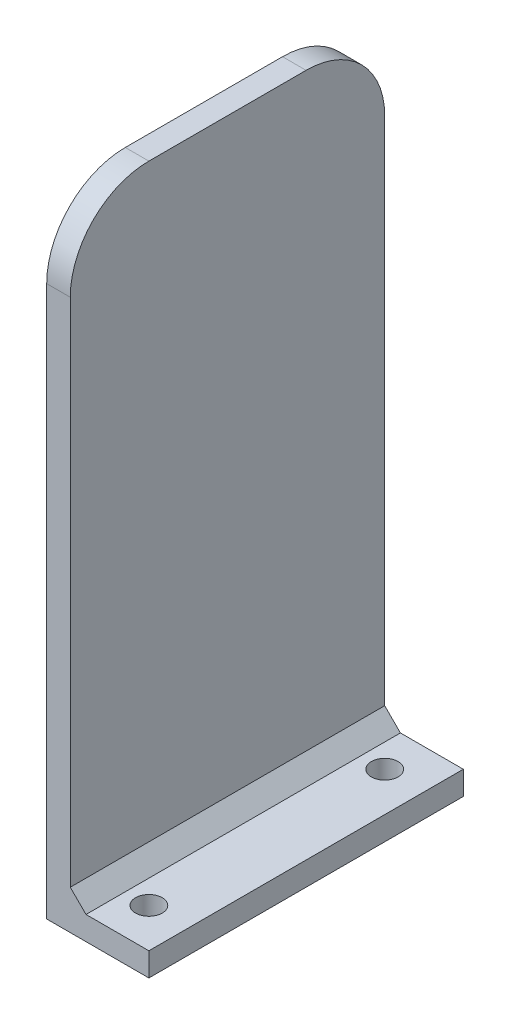
ISO-10303-21;
HEADER;
FILE_DESCRIPTION(('STEP AP214'),'2;1');
FILE_NAME('part.step','',(''),(''),'','','');
FILE_SCHEMA(('AUTOMOTIVE_DESIGN { 1 0 10303 214 1 1 1 1 }'));
ENDSEC;
DATA;
#1=APPLICATION_CONTEXT('core data for automotive mechanical design processes');
#2=APPLICATION_PROTOCOL_DEFINITION('international standard','automotive_design',2000,#1);
#3=PRODUCT_CONTEXT('',#1,'mechanical');
#4=PRODUCT('Part','Part','',(#3));
#5=PRODUCT_RELATED_PRODUCT_CATEGORY('part','',(#4));
#6=PRODUCT_DEFINITION_FORMATION('','',#4);
#7=PRODUCT_DEFINITION_CONTEXT('part definition',#1,'design');
#8=PRODUCT_DEFINITION('design','',#6,#7);
#9=PRODUCT_DEFINITION_SHAPE('','',#8);
#10=(LENGTH_UNIT() NAMED_UNIT(*) SI_UNIT(.MILLI.,.METRE.));
#11=(NAMED_UNIT(*) PLANE_ANGLE_UNIT() SI_UNIT($,.RADIAN.));
#12=(NAMED_UNIT(*) SI_UNIT($,.STERADIAN.) SOLID_ANGLE_UNIT());
#13=UNCERTAINTY_MEASURE_WITH_UNIT(LENGTH_MEASURE(1.E-05),#10,'distance_accuracy_value','');
#14=(GEOMETRIC_REPRESENTATION_CONTEXT(3) GLOBAL_UNCERTAINTY_ASSIGNED_CONTEXT((#13)) GLOBAL_UNIT_ASSIGNED_CONTEXT((#10,
#11,#12)) REPRESENTATION_CONTEXT('',''));
#15=CARTESIAN_POINT('',(0.,0.,0.));
#16=DIRECTION('',(0.,0.,1.));
#17=DIRECTION('',(1.,0.,0.));
#18=AXIS2_PLACEMENT_3D('',#15,#16,#17);
#19=CARTESIAN_POINT('',(0.,80.,20.));
#20=DIRECTION('',(1.,0.,0.));
#21=DIRECTION('',(0.,1.,0.));
#22=AXIS2_PLACEMENT_3D('',#19,#20,#21);
#23=PLANE('',#22);
#24=DIRECTION('',(0.,-1.,0.));
#25=VECTOR('',#24,1.);
#26=CARTESIAN_POINT('',(0.,80.,20.));
#27=LINE('',#26,#25);
#28=CARTESIAN_POINT('',(0.,70.,20.));
#29=VERTEX_POINT('',#28);
#30=CARTESIAN_POINT('',(0.,0.,20.));
#31=VERTEX_POINT('',#30);
#32=EDGE_CURVE('E113',#29,#31,#27,.T.);
#33=ORIENTED_EDGE('',*,*,#32,.F.);
#34=CARTESIAN_POINT('',(0.,70.,10.));
#35=DIRECTION('',(1.,0.,0.));
#36=DIRECTION('',(0.,1.,0.));
#37=AXIS2_PLACEMENT_3D('',#34,#35,#36);
#38=CIRCLE('',#37,10.);
#39=CARTESIAN_POINT('',(0.,80.,10.));
#40=VERTEX_POINT('',#39);
#41=EDGE_CURVE('E153',#29,#40,#38,.F.);
#42=ORIENTED_EDGE('',*,*,#41,.T.);
#43=DIRECTION('',(0.,0.,-1.));
#44=VECTOR('',#43,1.);
#45=CARTESIAN_POINT('',(0.,80.,20.));
#46=LINE('',#45,#44);
#47=CARTESIAN_POINT('',(0.,80.,-10.));
#48=VERTEX_POINT('',#47);
#49=EDGE_CURVE('E170',#40,#48,#46,.T.);
#50=ORIENTED_EDGE('',*,*,#49,.T.);
#51=CARTESIAN_POINT('',(0.,70.,-10.));
#52=DIRECTION('',(1.,0.,0.));
#53=DIRECTION('',(0.,1.,0.));
#54=AXIS2_PLACEMENT_3D('',#51,#52,#53);
#55=CIRCLE('',#54,10.);
#56=CARTESIAN_POINT('',(0.,70.,-20.));
#57=VERTEX_POINT('',#56);
#58=EDGE_CURVE('E151',#48,#57,#55,.F.);
#59=ORIENTED_EDGE('',*,*,#58,.T.);
#60=DIRECTION('',(0.,-1.,0.));
#61=VECTOR('',#60,1.);
#62=CARTESIAN_POINT('',(0.,80.,-20.));
#63=LINE('',#62,#61);
#64=CARTESIAN_POINT('',(0.,0.,-20.));
#65=VERTEX_POINT('',#64);
#66=EDGE_CURVE('E134',#57,#65,#63,.T.);
#67=ORIENTED_EDGE('',*,*,#66,.T.);
#68=DIRECTION('',(0.,0.,-1.));
#69=VECTOR('',#68,1.);
#70=CARTESIAN_POINT('',(0.,0.,20.));
#71=LINE('',#70,#69);
#72=EDGE_CURVE('E128',#31,#65,#71,.T.);
#73=ORIENTED_EDGE('',*,*,#72,.F.);
#74=EDGE_LOOP('',(#33,#42,#50,#59,#67,#73));
#75=FACE_BOUND('',#74,.T.);
#76=ADVANCED_FACE('F41',(#75),#23,.F.);
#77=CARTESIAN_POINT('',(0.,0.,20.));
#78=DIRECTION('',(0.,1.,0.));
#79=DIRECTION('',(0.,0.,1.));
#80=AXIS2_PLACEMENT_3D('',#77,#78,#79);
#81=PLANE('',#80);
#82=CARTESIAN_POINT('',(8.,0.,-15.));
#83=DIRECTION('',(0.,1.,0.));
#84=DIRECTION('',(0.,0.,1.));
#85=AXIS2_PLACEMENT_3D('',#82,#83,#84);
#86=CIRCLE('',#85,1.7);
#87=CARTESIAN_POINT('',(8.,0.,-13.3));
#88=VERTEX_POINT('',#87);
#89=EDGE_CURVE('E200',#88,#88,#86,.T.);
#90=ORIENTED_EDGE('',*,*,#89,.T.);
#91=EDGE_LOOP('',(#90));
#92=FACE_BOUND('',#91,.T.);
#93=CARTESIAN_POINT('',(8.,0.,15.));
#94=DIRECTION('',(0.,1.,0.));
#95=DIRECTION('',(0.,0.,1.));
#96=AXIS2_PLACEMENT_3D('',#93,#94,#95);
#97=CIRCLE('',#96,1.7);
#98=CARTESIAN_POINT('',(8.,0.,16.7));
#99=VERTEX_POINT('',#98);
#100=EDGE_CURVE('E206',#99,#99,#97,.T.);
#101=ORIENTED_EDGE('',*,*,#100,.T.);
#102=EDGE_LOOP('',(#101));
#103=FACE_BOUND('',#102,.T.);
#104=DIRECTION('',(1.,0.,0.));
#105=VECTOR('',#104,1.);
#106=CARTESIAN_POINT('',(0.,0.,-20.));
#107=LINE('',#106,#105);
#108=CARTESIAN_POINT('',(13.,0.,-20.));
#109=VERTEX_POINT('',#108);
#110=EDGE_CURVE('E196',#65,#109,#107,.T.);
#111=ORIENTED_EDGE('',*,*,#110,.T.);
#112=DIRECTION('',(0.,0.,-1.));
#113=VECTOR('',#112,1.);
#114=CARTESIAN_POINT('',(13.,0.,20.));
#115=LINE('',#114,#113);
#116=CARTESIAN_POINT('',(13.,0.,20.));
#117=VERTEX_POINT('',#116);
#118=EDGE_CURVE('E130',#117,#109,#115,.T.);
#119=ORIENTED_EDGE('',*,*,#118,.F.);
#120=DIRECTION('',(1.,0.,0.));
#121=VECTOR('',#120,1.);
#122=CARTESIAN_POINT('',(0.,0.,20.));
#123=LINE('',#122,#121);
#124=EDGE_CURVE('E117',#31,#117,#123,.T.);
#125=ORIENTED_EDGE('',*,*,#124,.F.);
#126=ORIENTED_EDGE('',*,*,#72,.T.);
#127=EDGE_LOOP('',(#111,#119,#125,#126));
#128=FACE_BOUND('',#127,.T.);
#129=ADVANCED_FACE('F127',(#92,#103,#128),#81,.F.);
#130=CARTESIAN_POINT('',(13.,0.,20.));
#131=DIRECTION('',(-1.,0.,0.));
#132=DIRECTION('',(0.,0.,1.));
#133=AXIS2_PLACEMENT_3D('',#130,#131,#132);
#134=PLANE('',#133);
#135=DIRECTION('',(0.,1.,0.));
#136=VECTOR('',#135,1.);
#137=CARTESIAN_POINT('',(13.,0.,-20.));
#138=LINE('',#137,#136);
#139=CARTESIAN_POINT('',(13.,3.,-20.));
#140=VERTEX_POINT('',#139);
#141=EDGE_CURVE('E195',#109,#140,#138,.T.);
#142=ORIENTED_EDGE('',*,*,#141,.T.);
#143=DIRECTION('',(0.,0.,-1.));
#144=VECTOR('',#143,1.);
#145=CARTESIAN_POINT('',(13.,3.,20.));
#146=LINE('',#145,#144);
#147=CARTESIAN_POINT('',(13.,3.,20.));
#148=VERTEX_POINT('',#147);
#149=EDGE_CURVE('E141',#148,#140,#146,.T.);
#150=ORIENTED_EDGE('',*,*,#149,.F.);
#151=DIRECTION('',(0.,1.,0.));
#152=VECTOR('',#151,1.);
#153=CARTESIAN_POINT('',(13.,0.,20.));
#154=LINE('',#153,#152);
#155=EDGE_CURVE('E132',#117,#148,#154,.T.);
#156=ORIENTED_EDGE('',*,*,#155,.F.);
#157=ORIENTED_EDGE('',*,*,#118,.T.);
#158=EDGE_LOOP('',(#142,#150,#156,#157));
#159=FACE_BOUND('',#158,.T.);
#160=ADVANCED_FACE('F221',(#159),#134,.F.);
#161=CARTESIAN_POINT('',(13.,3.,20.));
#162=DIRECTION('',(0.,-1.,0.));
#163=DIRECTION('',(1.,0.,0.));
#164=AXIS2_PLACEMENT_3D('',#161,#162,#163);
#165=PLANE('',#164);
#166=CARTESIAN_POINT('',(8.,3.,-15.));
#167=DIRECTION('',(0.,1.,0.));
#168=DIRECTION('',(-1.,0.,0.));
#169=AXIS2_PLACEMENT_3D('',#166,#167,#168);
#170=CIRCLE('',#169,1.7);
#171=CARTESIAN_POINT('',(6.3,3.,-15.));
#172=VERTEX_POINT('',#171);
#173=EDGE_CURVE('E209',#172,#172,#170,.T.);
#174=ORIENTED_EDGE('',*,*,#173,.F.);
#175=EDGE_LOOP('',(#174));
#176=FACE_BOUND('',#175,.T.);
#177=CARTESIAN_POINT('',(8.,3.,15.));
#178=DIRECTION('',(0.,1.,0.));
#179=DIRECTION('',(-1.,0.,0.));
#180=AXIS2_PLACEMENT_3D('',#177,#178,#179);
#181=CIRCLE('',#180,1.7);
#182=CARTESIAN_POINT('',(6.3,3.,15.));
#183=VERTEX_POINT('',#182);
#184=EDGE_CURVE('E210',#183,#183,#181,.T.);
#185=ORIENTED_EDGE('',*,*,#184,.F.);
#186=EDGE_LOOP('',(#185));
#187=FACE_BOUND('',#186,.T.);
#188=DIRECTION('',(-1.,0.,0.));
#189=VECTOR('',#188,1.);
#190=CARTESIAN_POINT('',(13.,3.,-20.));
#191=LINE('',#190,#189);
#192=CARTESIAN_POINT('',(5.,3.,-20.));
#193=VERTEX_POINT('',#192);
#194=EDGE_CURVE('E190',#140,#193,#191,.T.);
#195=ORIENTED_EDGE('',*,*,#194,.T.);
#196=DIRECTION('',(0.,0.,1.));
#197=VECTOR('',#196,1.);
#198=CARTESIAN_POINT('',(5.,3.,20.));
#199=LINE('',#198,#197);
#200=CARTESIAN_POINT('',(5.,3.,20.));
#201=VERTEX_POINT('',#200);
#202=EDGE_CURVE('E139',#193,#201,#199,.T.);
#203=ORIENTED_EDGE('',*,*,#202,.T.);
#204=DIRECTION('',(-1.,0.,0.));
#205=VECTOR('',#204,1.);
#206=CARTESIAN_POINT('',(13.,3.,20.));
#207=LINE('',#206,#205);
#208=EDGE_CURVE('E171',#148,#201,#207,.T.);
#209=ORIENTED_EDGE('',*,*,#208,.F.);
#210=ORIENTED_EDGE('',*,*,#149,.T.);
#211=EDGE_LOOP('',(#195,#203,#209,#210));
#212=FACE_BOUND('',#211,.T.);
#213=ADVANCED_FACE('F189',(#176,#187,#212),#165,.F.);
#214=CARTESIAN_POINT('',(3.,3.,20.));
#215=DIRECTION('',(-1.,0.,0.));
#216=DIRECTION('',(0.,-1.,0.));
#217=AXIS2_PLACEMENT_3D('',#214,#215,#216);
#218=PLANE('',#217);
#219=DIRECTION('',(0.,0.,-1.));
#220=VECTOR('',#219,1.);
#221=CARTESIAN_POINT('',(3.00000000000001,80.,20.));
#222=LINE('',#221,#220);
#223=CARTESIAN_POINT('',(3.00000000000001,80.,10.));
#224=VERTEX_POINT('',#223);
#225=CARTESIAN_POINT('',(3.00000000000001,80.,-10.));
#226=VERTEX_POINT('',#225);
#227=EDGE_CURVE('E165',#224,#226,#222,.T.);
#228=ORIENTED_EDGE('',*,*,#227,.F.);
#229=CARTESIAN_POINT('',(3.00000000000001,70.,10.));
#230=DIRECTION('',(-1.,0.,0.));
#231=DIRECTION('',(0.,-1.,0.));
#232=AXIS2_PLACEMENT_3D('',#229,#230,#231);
#233=CIRCLE('',#232,10.);
#234=CARTESIAN_POINT('',(3.00000000000001,70.,20.));
#235=VERTEX_POINT('',#234);
#236=EDGE_CURVE('E49',#224,#235,#233,.F.);
#237=ORIENTED_EDGE('',*,*,#236,.T.);
#238=DIRECTION('',(0.,1.,0.));
#239=VECTOR('',#238,1.);
#240=CARTESIAN_POINT('',(3.,3.,20.));
#241=LINE('',#240,#239);
#242=CARTESIAN_POINT('',(3.,5.00000000000002,20.));
#243=VERTEX_POINT('',#242);
#244=EDGE_CURVE('E163',#243,#235,#241,.T.);
#245=ORIENTED_EDGE('',*,*,#244,.F.);
#246=DIRECTION('',(0.,0.,-1.));
#247=VECTOR('',#246,1.);
#248=CARTESIAN_POINT('',(3.,5.00000000000002,-20.));
#249=LINE('',#248,#247);
#250=CARTESIAN_POINT('',(3.,5.00000000000002,-20.));
#251=VERTEX_POINT('',#250);
#252=EDGE_CURVE('E136',#243,#251,#249,.T.);
#253=ORIENTED_EDGE('',*,*,#252,.T.);
#254=DIRECTION('',(0.,1.,0.));
#255=VECTOR('',#254,1.);
#256=CARTESIAN_POINT('',(3.,3.,-20.));
#257=LINE('',#256,#255);
#258=CARTESIAN_POINT('',(3.00000000000001,70.,-20.));
#259=VERTEX_POINT('',#258);
#260=EDGE_CURVE('E123',#251,#259,#257,.T.);
#261=ORIENTED_EDGE('',*,*,#260,.T.);
#262=CARTESIAN_POINT('',(3.00000000000001,70.,-10.));
#263=DIRECTION('',(-1.,0.,0.));
#264=DIRECTION('',(0.,-1.,0.));
#265=AXIS2_PLACEMENT_3D('',#262,#263,#264);
#266=CIRCLE('',#265,10.);
#267=EDGE_CURVE('E61',#259,#226,#266,.F.);
#268=ORIENTED_EDGE('',*,*,#267,.T.);
#269=EDGE_LOOP('',(#228,#237,#245,#253,#261,#268));
#270=FACE_BOUND('',#269,.T.);
#271=ADVANCED_FACE('F162',(#270),#218,.F.);
#272=CARTESIAN_POINT('',(3.00000000000001,80.,20.));
#273=DIRECTION('',(0.,-1.,0.));
#274=DIRECTION('',(0.,0.,-1.));
#275=AXIS2_PLACEMENT_3D('',#272,#273,#274);
#276=PLANE('',#275);
#277=ORIENTED_EDGE('',*,*,#49,.F.);
#278=DIRECTION('',(-1.,0.,0.));
#279=VECTOR('',#278,1.);
#280=CARTESIAN_POINT('',(3.00000000000001,80.,10.));
#281=LINE('',#280,#279);
#282=EDGE_CURVE('E158',#40,#224,#281,.F.);
#283=ORIENTED_EDGE('',*,*,#282,.T.);
#284=ORIENTED_EDGE('',*,*,#227,.T.);
#285=DIRECTION('',(-1.,0.,0.));
#286=VECTOR('',#285,1.);
#287=CARTESIAN_POINT('',(3.00000000000001,80.,-10.));
#288=LINE('',#287,#286);
#289=EDGE_CURVE('E155',#226,#48,#288,.T.);
#290=ORIENTED_EDGE('',*,*,#289,.T.);
#291=EDGE_LOOP('',(#277,#283,#284,#290));
#292=FACE_BOUND('',#291,.T.);
#293=ADVANCED_FACE('F177',(#292),#276,.F.);
#294=CARTESIAN_POINT('',(0.,0.,20.));
#295=DIRECTION('',(0.,0.,1.));
#296=DIRECTION('',(1.,0.,0.));
#297=AXIS2_PLACEMENT_3D('',#294,#295,#296);
#298=PLANE('',#297);
#299=ORIENTED_EDGE('',*,*,#244,.T.);
#300=DIRECTION('',(-1.,0.,0.));
#301=VECTOR('',#300,1.);
#302=CARTESIAN_POINT('',(0.,70.,20.));
#303=LINE('',#302,#301);
#304=EDGE_CURVE('E120',#235,#29,#303,.T.);
#305=ORIENTED_EDGE('',*,*,#304,.T.);
#306=ORIENTED_EDGE('',*,*,#32,.T.);
#307=ORIENTED_EDGE('',*,*,#124,.T.);
#308=ORIENTED_EDGE('',*,*,#155,.T.);
#309=ORIENTED_EDGE('',*,*,#208,.T.);
#310=DIRECTION('',(0.707106781186545,-0.70710678118655,0.));
#311=VECTOR('',#310,1.);
#312=CARTESIAN_POINT('',(3.,5.00000000000002,20.));
#313=LINE('',#312,#311);
#314=EDGE_CURVE('E148',#201,#243,#313,.F.);
#315=ORIENTED_EDGE('',*,*,#314,.T.);
#316=EDGE_LOOP('',(#299,#305,#306,#307,#308,#309,#315));
#317=FACE_BOUND('',#316,.T.);
#318=ADVANCED_FACE('F116',(#317),#298,.T.);
#319=CARTESIAN_POINT('',(0.,0.,-20.));
#320=DIRECTION('',(0.,0.,1.));
#321=DIRECTION('',(1.,0.,0.));
#322=AXIS2_PLACEMENT_3D('',#319,#320,#321);
#323=PLANE('',#322);
#324=ORIENTED_EDGE('',*,*,#66,.F.);
#325=DIRECTION('',(-1.,0.,0.));
#326=VECTOR('',#325,1.);
#327=CARTESIAN_POINT('',(0.,70.,-20.));
#328=LINE('',#327,#326);
#329=EDGE_CURVE('E11',#57,#259,#328,.F.);
#330=ORIENTED_EDGE('',*,*,#329,.T.);
#331=ORIENTED_EDGE('',*,*,#260,.F.);
#332=DIRECTION('',(-0.707106781186545,0.70710678118655,0.));
#333=VECTOR('',#332,1.);
#334=CARTESIAN_POINT('',(4.00000000000002,3.99999999999999,-20.));
#335=LINE('',#334,#333);
#336=EDGE_CURVE('E146',#251,#193,#335,.F.);
#337=ORIENTED_EDGE('',*,*,#336,.T.);
#338=ORIENTED_EDGE('',*,*,#194,.F.);
#339=ORIENTED_EDGE('',*,*,#141,.F.);
#340=ORIENTED_EDGE('',*,*,#110,.F.);
#341=EDGE_LOOP('',(#324,#330,#331,#337,#338,#339,#340));
#342=FACE_BOUND('',#341,.T.);
#343=ADVANCED_FACE('F194',(#342),#323,.F.);
#344=CARTESIAN_POINT('',(8.00000000000001,-37.,15.));
#345=DIRECTION('',(0.,1.,0.));
#346=DIRECTION('',(-1.,0.,0.));
#347=AXIS2_PLACEMENT_3D('',#344,#345,#346);
#348=CYLINDRICAL_SURFACE('',#347,1.7);
#349=ORIENTED_EDGE('',*,*,#184,.T.);
#350=EDGE_LOOP('',(#349));
#351=FACE_BOUND('',#350,.T.);
#352=ORIENTED_EDGE('',*,*,#100,.F.);
#353=EDGE_LOOP('',(#352));
#354=FACE_BOUND('',#353,.T.);
#355=ADVANCED_FACE('F225',(#351,#354),#348,.F.);
#356=CARTESIAN_POINT('',(8.00000000000001,-37.,-15.));
#357=DIRECTION('',(0.,1.,0.));
#358=DIRECTION('',(-1.,0.,0.));
#359=AXIS2_PLACEMENT_3D('',#356,#357,#358);
#360=CYLINDRICAL_SURFACE('',#359,1.7);
#361=ORIENTED_EDGE('',*,*,#173,.T.);
#362=EDGE_LOOP('',(#361));
#363=FACE_BOUND('',#362,.T.);
#364=ORIENTED_EDGE('',*,*,#89,.F.);
#365=EDGE_LOOP('',(#364));
#366=FACE_BOUND('',#365,.T.);
#367=ADVANCED_FACE('F216',(#363,#366),#360,.F.);
#368=CARTESIAN_POINT('',(3.,5.00000000000002,20.));
#369=DIRECTION('',(0.70710678118655,0.707106781186545,0.));
#370=DIRECTION('',(0.,0.,1.));
#371=AXIS2_PLACEMENT_3D('',#368,#369,#370);
#372=PLANE('',#371);
#373=ORIENTED_EDGE('',*,*,#314,.F.);
#374=ORIENTED_EDGE('',*,*,#202,.F.);
#375=ORIENTED_EDGE('',*,*,#336,.F.);
#376=ORIENTED_EDGE('',*,*,#252,.F.);
#377=EDGE_LOOP('',(#373,#374,#375,#376));
#378=FACE_BOUND('',#377,.T.);
#379=ADVANCED_FACE('F242',(#378),#372,.T.);
#380=CARTESIAN_POINT('',(0.,70.,10.));
#381=DIRECTION('',(1.,0.,0.));
#382=DIRECTION('',(0.,0.,-1.));
#383=AXIS2_PLACEMENT_3D('',#380,#381,#382);
#384=CYLINDRICAL_SURFACE('',#383,10.);
#385=ORIENTED_EDGE('',*,*,#236,.F.);
#386=ORIENTED_EDGE('',*,*,#282,.F.);
#387=ORIENTED_EDGE('',*,*,#41,.F.);
#388=ORIENTED_EDGE('',*,*,#304,.F.);
#389=EDGE_LOOP('',(#385,#386,#387,#388));
#390=FACE_BOUND('',#389,.T.);
#391=ADVANCED_FACE('F173',(#390),#384,.T.);
#392=CARTESIAN_POINT('',(3.00000000000001,70.,-10.));
#393=DIRECTION('',(-1.,0.,0.));
#394=DIRECTION('',(0.,0.,1.));
#395=AXIS2_PLACEMENT_3D('',#392,#393,#394);
#396=CYLINDRICAL_SURFACE('',#395,10.);
#397=ORIENTED_EDGE('',*,*,#267,.F.);
#398=ORIENTED_EDGE('',*,*,#329,.F.);
#399=ORIENTED_EDGE('',*,*,#58,.F.);
#400=ORIENTED_EDGE('',*,*,#289,.F.);
#401=EDGE_LOOP('',(#397,#398,#399,#400));
#402=FACE_BOUND('',#401,.T.);
#403=ADVANCED_FACE('F43',(#402),#396,.T.);
#404=CLOSED_SHELL('',(#76,#129,#160,#213,#271,#293,#318,#343,#355,#367,#379,#391,#403));
#405=MANIFOLD_SOLID_BREP('B2',#404);
#406=ADVANCED_BREP_SHAPE_REPRESENTATION('',(#18,#405),#14);
#407=SHAPE_DEFINITION_REPRESENTATION(#9,#406);
ENDSEC;
END-ISO-10303-21;
